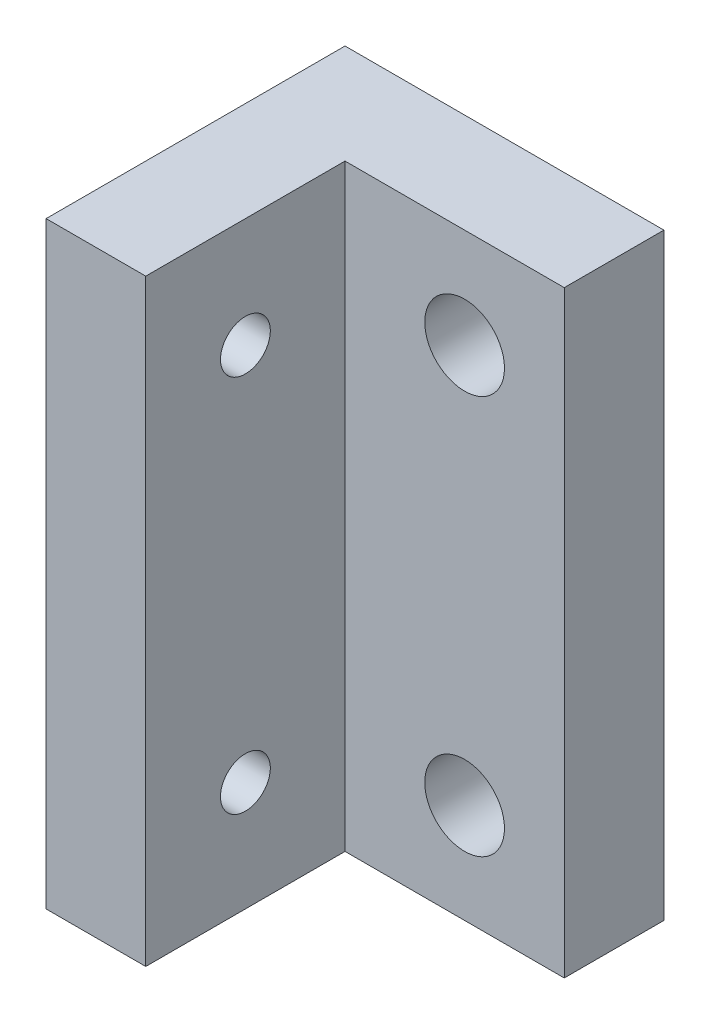
ISO-10303-21;
HEADER;
FILE_DESCRIPTION(('STEP AP214'),'2;1');
FILE_NAME('part.step','',(''),(''),'','','');
FILE_SCHEMA(('AUTOMOTIVE_DESIGN { 1 0 10303 214 1 1 1 1 }'));
ENDSEC;
DATA;
#1=APPLICATION_CONTEXT('core data for automotive mechanical design processes');
#2=APPLICATION_PROTOCOL_DEFINITION('international standard','automotive_design',2000,#1);
#3=PRODUCT_CONTEXT('',#1,'mechanical');
#4=PRODUCT('Part','Part','',(#3));
#5=PRODUCT_RELATED_PRODUCT_CATEGORY('part','',(#4));
#6=PRODUCT_DEFINITION_FORMATION('','',#4);
#7=PRODUCT_DEFINITION_CONTEXT('part definition',#1,'design');
#8=PRODUCT_DEFINITION('design','',#6,#7);
#9=PRODUCT_DEFINITION_SHAPE('','',#8);
#10=(LENGTH_UNIT() NAMED_UNIT(*) SI_UNIT(.MILLI.,.METRE.));
#11=(NAMED_UNIT(*) PLANE_ANGLE_UNIT() SI_UNIT($,.RADIAN.));
#12=(NAMED_UNIT(*) SI_UNIT($,.STERADIAN.) SOLID_ANGLE_UNIT());
#13=UNCERTAINTY_MEASURE_WITH_UNIT(LENGTH_MEASURE(1.E-05),#10,'distance_accuracy_value','');
#14=(GEOMETRIC_REPRESENTATION_CONTEXT(3) GLOBAL_UNCERTAINTY_ASSIGNED_CONTEXT((#13)) GLOBAL_UNIT_ASSIGNED_CONTEXT((#10,
#11,#12)) REPRESENTATION_CONTEXT('',''));
#15=CARTESIAN_POINT('',(0.,0.,0.));
#16=DIRECTION('',(0.,0.,1.));
#17=DIRECTION('',(1.,0.,0.));
#18=AXIS2_PLACEMENT_3D('',#15,#16,#17);
#19=CARTESIAN_POINT('',(0.,15.,0.));
#20=DIRECTION('',(1.,0.,0.));
#21=DIRECTION('',(0.,0.,-1.));
#22=AXIS2_PLACEMENT_3D('',#19,#20,#21);
#23=PLANE('',#22);
#24=CARTESIAN_POINT('',(0.,-9.5,10.));
#25=DIRECTION('',(-1.,0.,0.));
#26=DIRECTION('',(0.,0.,1.));
#27=AXIS2_PLACEMENT_3D('',#24,#25,#26);
#28=CIRCLE('',#27,1.25);
#29=CARTESIAN_POINT('',(0.,-9.5,11.25));
#30=VERTEX_POINT('',#29);
#31=EDGE_CURVE('E149',#30,#30,#28,.T.);
#32=ORIENTED_EDGE('',*,*,#31,.F.);
#33=EDGE_LOOP('',(#32));
#34=FACE_BOUND('',#33,.T.);
#35=CARTESIAN_POINT('',(0.,9.5,10.));
#36=DIRECTION('',(-1.,0.,0.));
#37=DIRECTION('',(0.,0.,1.));
#38=AXIS2_PLACEMENT_3D('',#35,#36,#37);
#39=CIRCLE('',#38,1.25);
#40=CARTESIAN_POINT('',(0.,9.5,11.25));
#41=VERTEX_POINT('',#40);
#42=EDGE_CURVE('E138',#41,#41,#39,.T.);
#43=ORIENTED_EDGE('',*,*,#42,.F.);
#44=EDGE_LOOP('',(#43));
#45=FACE_BOUND('',#44,.T.);
#46=DIRECTION('',(0.,0.,1.));
#47=VECTOR('',#46,1.);
#48=CARTESIAN_POINT('',(0.,-15.,0.));
#49=LINE('',#48,#47);
#50=CARTESIAN_POINT('',(0.,-15.,0.));
#51=VERTEX_POINT('',#50);
#52=CARTESIAN_POINT('',(0.,-15.,15.));
#53=VERTEX_POINT('',#52);
#54=EDGE_CURVE('E119',#51,#53,#49,.T.);
#55=ORIENTED_EDGE('',*,*,#54,.T.);
#56=DIRECTION('',(0.,-1.,0.));
#57=VECTOR('',#56,1.);
#58=CARTESIAN_POINT('',(0.,15.,15.));
#59=LINE('',#58,#57);
#60=CARTESIAN_POINT('',(0.,15.,15.));
#61=VERTEX_POINT('',#60);
#62=EDGE_CURVE('E11',#61,#53,#59,.T.);
#63=ORIENTED_EDGE('',*,*,#62,.F.);
#64=DIRECTION('',(0.,0.,1.));
#65=VECTOR('',#64,1.);
#66=CARTESIAN_POINT('',(0.,15.,0.));
#67=LINE('',#66,#65);
#68=CARTESIAN_POINT('',(0.,15.,0.));
#69=VERTEX_POINT('',#68);
#70=EDGE_CURVE('E130',#69,#61,#67,.T.);
#71=ORIENTED_EDGE('',*,*,#70,.F.);
#72=DIRECTION('',(0.,-1.,0.));
#73=VECTOR('',#72,1.);
#74=CARTESIAN_POINT('',(0.,15.,0.));
#75=LINE('',#74,#73);
#76=EDGE_CURVE('E115',#69,#51,#75,.T.);
#77=ORIENTED_EDGE('',*,*,#76,.T.);
#78=EDGE_LOOP('',(#55,#63,#71,#77));
#79=FACE_BOUND('',#78,.T.);
#80=ADVANCED_FACE('F33',(#34,#45,#79),#23,.F.);
#81=CARTESIAN_POINT('',(0.,15.,15.));
#82=DIRECTION('',(0.,0.,-1.));
#83=DIRECTION('',(-1.,0.,0.));
#84=AXIS2_PLACEMENT_3D('',#81,#82,#83);
#85=PLANE('',#84);
#86=DIRECTION('',(1.,0.,0.));
#87=VECTOR('',#86,1.);
#88=CARTESIAN_POINT('',(0.,-15.,15.));
#89=LINE('',#88,#87);
#90=CARTESIAN_POINT('',(5.,-15.,15.));
#91=VERTEX_POINT('',#90);
#92=EDGE_CURVE('E122',#53,#91,#89,.T.);
#93=ORIENTED_EDGE('',*,*,#92,.T.);
#94=DIRECTION('',(0.,-1.,0.));
#95=VECTOR('',#94,1.);
#96=CARTESIAN_POINT('',(5.,15.,15.));
#97=LINE('',#96,#95);
#98=CARTESIAN_POINT('',(5.,15.,15.));
#99=VERTEX_POINT('',#98);
#100=EDGE_CURVE('E42',#99,#91,#97,.T.);
#101=ORIENTED_EDGE('',*,*,#100,.F.);
#102=DIRECTION('',(1.,0.,0.));
#103=VECTOR('',#102,1.);
#104=CARTESIAN_POINT('',(0.,15.,15.));
#105=LINE('',#104,#103);
#106=EDGE_CURVE('E88',#61,#99,#105,.T.);
#107=ORIENTED_EDGE('',*,*,#106,.F.);
#108=ORIENTED_EDGE('',*,*,#62,.T.);
#109=EDGE_LOOP('',(#93,#101,#107,#108));
#110=FACE_BOUND('',#109,.T.);
#111=ADVANCED_FACE('F162',(#110),#85,.F.);
#112=CARTESIAN_POINT('',(5.,15.,15.));
#113=DIRECTION('',(-1.,0.,0.));
#114=DIRECTION('',(0.,0.,1.));
#115=AXIS2_PLACEMENT_3D('',#112,#113,#114);
#116=PLANE('',#115);
#117=CARTESIAN_POINT('',(5.,-9.5,10.));
#118=DIRECTION('',(-1.,0.,0.));
#119=DIRECTION('',(0.,0.,1.));
#120=AXIS2_PLACEMENT_3D('',#117,#118,#119);
#121=CIRCLE('',#120,1.25);
#122=CARTESIAN_POINT('',(5.,-9.5,11.25));
#123=VERTEX_POINT('',#122);
#124=EDGE_CURVE('E36',#123,#123,#121,.T.);
#125=ORIENTED_EDGE('',*,*,#124,.T.);
#126=EDGE_LOOP('',(#125));
#127=FACE_BOUND('',#126,.T.);
#128=CARTESIAN_POINT('',(5.,9.5,10.));
#129=DIRECTION('',(-1.,0.,0.));
#130=DIRECTION('',(0.,0.,1.));
#131=AXIS2_PLACEMENT_3D('',#128,#129,#130);
#132=CIRCLE('',#131,1.25);
#133=CARTESIAN_POINT('',(5.,9.5,11.25));
#134=VERTEX_POINT('',#133);
#135=EDGE_CURVE('E135',#134,#134,#132,.T.);
#136=ORIENTED_EDGE('',*,*,#135,.T.);
#137=EDGE_LOOP('',(#136));
#138=FACE_BOUND('',#137,.T.);
#139=DIRECTION('',(0.,0.,-1.));
#140=VECTOR('',#139,1.);
#141=CARTESIAN_POINT('',(5.,-15.,15.));
#142=LINE('',#141,#140);
#143=CARTESIAN_POINT('',(5.,-15.,5.));
#144=VERTEX_POINT('',#143);
#145=EDGE_CURVE('E125',#91,#144,#142,.T.);
#146=ORIENTED_EDGE('',*,*,#145,.T.);
#147=DIRECTION('',(0.,-1.,0.));
#148=VECTOR('',#147,1.);
#149=CARTESIAN_POINT('',(5.,15.,5.));
#150=LINE('',#149,#148);
#151=CARTESIAN_POINT('',(5.,15.,5.));
#152=VERTEX_POINT('',#151);
#153=EDGE_CURVE('E110',#152,#144,#150,.T.);
#154=ORIENTED_EDGE('',*,*,#153,.F.);
#155=DIRECTION('',(0.,0.,-1.));
#156=VECTOR('',#155,1.);
#157=CARTESIAN_POINT('',(5.,15.,15.));
#158=LINE('',#157,#156);
#159=EDGE_CURVE('E101',#99,#152,#158,.T.);
#160=ORIENTED_EDGE('',*,*,#159,.F.);
#161=ORIENTED_EDGE('',*,*,#100,.T.);
#162=EDGE_LOOP('',(#146,#154,#160,#161));
#163=FACE_BOUND('',#162,.T.);
#164=ADVANCED_FACE('F165',(#127,#138,#163),#116,.F.);
#165=CARTESIAN_POINT('',(16.,15.,5.));
#166=DIRECTION('',(0.,0.,-1.));
#167=DIRECTION('',(-1.,0.,0.));
#168=AXIS2_PLACEMENT_3D('',#165,#166,#167);
#169=PLANE('',#168);
#170=CARTESIAN_POINT('',(11.,-10.,5.));
#171=DIRECTION('',(0.,0.,1.));
#172=DIRECTION('',(1.,0.,0.));
#173=AXIS2_PLACEMENT_3D('',#170,#171,#172);
#174=CIRCLE('',#173,2.);
#175=CARTESIAN_POINT('',(13.,-10.,5.));
#176=VERTEX_POINT('',#175);
#177=EDGE_CURVE('E137',#176,#176,#174,.T.);
#178=ORIENTED_EDGE('',*,*,#177,.F.);
#179=EDGE_LOOP('',(#178));
#180=FACE_BOUND('',#179,.T.);
#181=CARTESIAN_POINT('',(11.,10.,5.));
#182=DIRECTION('',(0.,0.,1.));
#183=DIRECTION('',(1.,0.,0.));
#184=AXIS2_PLACEMENT_3D('',#181,#182,#183);
#185=CIRCLE('',#184,2.);
#186=CARTESIAN_POINT('',(13.,10.,5.));
#187=VERTEX_POINT('',#186);
#188=EDGE_CURVE('E153',#187,#187,#185,.T.);
#189=ORIENTED_EDGE('',*,*,#188,.F.);
#190=EDGE_LOOP('',(#189));
#191=FACE_BOUND('',#190,.T.);
#192=DIRECTION('',(1.,0.,0.));
#193=VECTOR('',#192,1.);
#194=CARTESIAN_POINT('',(16.,-15.,5.));
#195=LINE('',#194,#193);
#196=CARTESIAN_POINT('',(16.,-15.,5.));
#197=VERTEX_POINT('',#196);
#198=EDGE_CURVE('E109',#144,#197,#195,.T.);
#199=ORIENTED_EDGE('',*,*,#198,.T.);
#200=DIRECTION('',(0.,-1.,0.));
#201=VECTOR('',#200,1.);
#202=CARTESIAN_POINT('',(16.,15.,5.));
#203=LINE('',#202,#201);
#204=CARTESIAN_POINT('',(16.,15.,5.));
#205=VERTEX_POINT('',#204);
#206=EDGE_CURVE('E106',#205,#197,#203,.T.);
#207=ORIENTED_EDGE('',*,*,#206,.F.);
#208=DIRECTION('',(1.,0.,0.));
#209=VECTOR('',#208,1.);
#210=CARTESIAN_POINT('',(16.,15.,5.));
#211=LINE('',#210,#209);
#212=EDGE_CURVE('E95',#152,#205,#211,.T.);
#213=ORIENTED_EDGE('',*,*,#212,.F.);
#214=ORIENTED_EDGE('',*,*,#153,.T.);
#215=EDGE_LOOP('',(#199,#207,#213,#214));
#216=FACE_BOUND('',#215,.T.);
#217=ADVANCED_FACE('F107',(#180,#191,#216),#169,.F.);
#218=CARTESIAN_POINT('',(16.,15.,0.));
#219=DIRECTION('',(-1.,0.,0.));
#220=DIRECTION('',(0.,0.,1.));
#221=AXIS2_PLACEMENT_3D('',#218,#219,#220);
#222=PLANE('',#221);
#223=DIRECTION('',(0.,0.,-1.));
#224=VECTOR('',#223,1.);
#225=CARTESIAN_POINT('',(16.,-15.,0.));
#226=LINE('',#225,#224);
#227=CARTESIAN_POINT('',(16.,-15.,0.));
#228=VERTEX_POINT('',#227);
#229=EDGE_CURVE('E74',#197,#228,#226,.T.);
#230=ORIENTED_EDGE('',*,*,#229,.T.);
#231=DIRECTION('',(0.,-1.,0.));
#232=VECTOR('',#231,1.);
#233=CARTESIAN_POINT('',(16.,15.,0.));
#234=LINE('',#233,#232);
#235=CARTESIAN_POINT('',(16.,15.,0.));
#236=VERTEX_POINT('',#235);
#237=EDGE_CURVE('E111',#236,#228,#234,.T.);
#238=ORIENTED_EDGE('',*,*,#237,.F.);
#239=DIRECTION('',(0.,0.,-1.));
#240=VECTOR('',#239,1.);
#241=CARTESIAN_POINT('',(16.,15.,0.));
#242=LINE('',#241,#240);
#243=EDGE_CURVE('E99',#205,#236,#242,.T.);
#244=ORIENTED_EDGE('',*,*,#243,.F.);
#245=ORIENTED_EDGE('',*,*,#206,.T.);
#246=EDGE_LOOP('',(#230,#238,#244,#245));
#247=FACE_BOUND('',#246,.T.);
#248=ADVANCED_FACE('F113',(#247),#222,.F.);
#249=CARTESIAN_POINT('',(0.,15.,0.));
#250=DIRECTION('',(0.,0.,1.));
#251=DIRECTION('',(1.,0.,0.));
#252=AXIS2_PLACEMENT_3D('',#249,#250,#251);
#253=PLANE('',#252);
#254=CARTESIAN_POINT('',(11.,-10.,0.));
#255=DIRECTION('',(0.,0.,1.));
#256=DIRECTION('',(1.,0.,0.));
#257=AXIS2_PLACEMENT_3D('',#254,#255,#256);
#258=CIRCLE('',#257,2.);
#259=CARTESIAN_POINT('',(13.,-10.,0.));
#260=VERTEX_POINT('',#259);
#261=EDGE_CURVE('E142',#260,#260,#258,.T.);
#262=ORIENTED_EDGE('',*,*,#261,.T.);
#263=EDGE_LOOP('',(#262));
#264=FACE_BOUND('',#263,.T.);
#265=CARTESIAN_POINT('',(11.,10.,0.));
#266=DIRECTION('',(0.,0.,1.));
#267=DIRECTION('',(1.,0.,0.));
#268=AXIS2_PLACEMENT_3D('',#265,#266,#267);
#269=CIRCLE('',#268,2.);
#270=CARTESIAN_POINT('',(13.,10.,0.));
#271=VERTEX_POINT('',#270);
#272=EDGE_CURVE('E123',#271,#271,#269,.T.);
#273=ORIENTED_EDGE('',*,*,#272,.T.);
#274=EDGE_LOOP('',(#273));
#275=FACE_BOUND('',#274,.T.);
#276=DIRECTION('',(-1.,0.,0.));
#277=VECTOR('',#276,1.);
#278=CARTESIAN_POINT('',(0.,-15.,0.));
#279=LINE('',#278,#277);
#280=EDGE_CURVE('E80',#228,#51,#279,.T.);
#281=ORIENTED_EDGE('',*,*,#280,.T.);
#282=ORIENTED_EDGE('',*,*,#76,.F.);
#283=DIRECTION('',(-1.,0.,0.));
#284=VECTOR('',#283,1.);
#285=CARTESIAN_POINT('',(0.,15.,0.));
#286=LINE('',#285,#284);
#287=EDGE_CURVE('E51',#236,#69,#286,.T.);
#288=ORIENTED_EDGE('',*,*,#287,.F.);
#289=ORIENTED_EDGE('',*,*,#237,.T.);
#290=EDGE_LOOP('',(#281,#282,#288,#289));
#291=FACE_BOUND('',#290,.T.);
#292=ADVANCED_FACE('F170',(#264,#275,#291),#253,.F.);
#293=CARTESIAN_POINT('',(0.,15.,0.));
#294=DIRECTION('',(0.,1.,0.));
#295=DIRECTION('',(0.,0.,1.));
#296=AXIS2_PLACEMENT_3D('',#293,#294,#295);
#297=PLANE('',#296);
#298=ORIENTED_EDGE('',*,*,#70,.T.);
#299=ORIENTED_EDGE('',*,*,#106,.T.);
#300=ORIENTED_EDGE('',*,*,#159,.T.);
#301=ORIENTED_EDGE('',*,*,#212,.T.);
#302=ORIENTED_EDGE('',*,*,#243,.T.);
#303=ORIENTED_EDGE('',*,*,#287,.T.);
#304=EDGE_LOOP('',(#298,#299,#300,#301,#302,#303));
#305=FACE_BOUND('',#304,.T.);
#306=ADVANCED_FACE('F97',(#305),#297,.T.);
#307=CARTESIAN_POINT('',(0.,-15.,0.));
#308=DIRECTION('',(0.,1.,0.));
#309=DIRECTION('',(0.,0.,1.));
#310=AXIS2_PLACEMENT_3D('',#307,#308,#309);
#311=PLANE('',#310);
#312=ORIENTED_EDGE('',*,*,#54,.F.);
#313=ORIENTED_EDGE('',*,*,#280,.F.);
#314=ORIENTED_EDGE('',*,*,#229,.F.);
#315=ORIENTED_EDGE('',*,*,#198,.F.);
#316=ORIENTED_EDGE('',*,*,#145,.F.);
#317=ORIENTED_EDGE('',*,*,#92,.F.);
#318=EDGE_LOOP('',(#312,#313,#314,#315,#316,#317));
#319=FACE_BOUND('',#318,.T.);
#320=ADVANCED_FACE('F168',(#319),#311,.F.);
#321=CARTESIAN_POINT('',(11.,10.,0.));
#322=DIRECTION('',(0.,0.,1.));
#323=DIRECTION('',(1.,0.,0.));
#324=AXIS2_PLACEMENT_3D('',#321,#322,#323);
#325=CYLINDRICAL_SURFACE('',#324,2.);
#326=ORIENTED_EDGE('',*,*,#272,.F.);
#327=EDGE_LOOP('',(#326));
#328=FACE_BOUND('',#327,.T.);
#329=ORIENTED_EDGE('',*,*,#188,.T.);
#330=EDGE_LOOP('',(#329));
#331=FACE_BOUND('',#330,.T.);
#332=ADVANCED_FACE('F211',(#328,#331),#325,.F.);
#333=CARTESIAN_POINT('',(11.,-10.,0.));
#334=DIRECTION('',(0.,0.,1.));
#335=DIRECTION('',(1.,0.,0.));
#336=AXIS2_PLACEMENT_3D('',#333,#334,#335);
#337=CYLINDRICAL_SURFACE('',#336,2.);
#338=ORIENTED_EDGE('',*,*,#261,.F.);
#339=EDGE_LOOP('',(#338));
#340=FACE_BOUND('',#339,.T.);
#341=ORIENTED_EDGE('',*,*,#177,.T.);
#342=EDGE_LOOP('',(#341));
#343=FACE_BOUND('',#342,.T.);
#344=ADVANCED_FACE('F213',(#340,#343),#337,.F.);
#345=CARTESIAN_POINT('',(16.,9.5,9.99999999999999));
#346=DIRECTION('',(-1.,0.,0.));
#347=DIRECTION('',(0.,0.,1.));
#348=AXIS2_PLACEMENT_3D('',#345,#346,#347);
#349=CYLINDRICAL_SURFACE('',#348,1.25);
#350=ORIENTED_EDGE('',*,*,#42,.T.);
#351=EDGE_LOOP('',(#350));
#352=FACE_BOUND('',#351,.T.);
#353=ORIENTED_EDGE('',*,*,#135,.F.);
#354=EDGE_LOOP('',(#353));
#355=FACE_BOUND('',#354,.T.);
#356=ADVANCED_FACE('F194',(#352,#355),#349,.F.);
#357=CARTESIAN_POINT('',(16.,-9.5,9.99999999999999));
#358=DIRECTION('',(-1.,0.,0.));
#359=DIRECTION('',(0.,0.,1.));
#360=AXIS2_PLACEMENT_3D('',#357,#358,#359);
#361=CYLINDRICAL_SURFACE('',#360,1.25);
#362=ORIENTED_EDGE('',*,*,#31,.T.);
#363=EDGE_LOOP('',(#362));
#364=FACE_BOUND('',#363,.T.);
#365=ORIENTED_EDGE('',*,*,#124,.F.);
#366=EDGE_LOOP('',(#365));
#367=FACE_BOUND('',#366,.T.);
#368=ADVANCED_FACE('F191',(#364,#367),#361,.F.);
#369=CLOSED_SHELL('',(#80,#111,#164,#217,#248,#292,#306,#320,#332,#344,#356,#368));
#370=MANIFOLD_SOLID_BREP('B2',#369);
#371=ADVANCED_BREP_SHAPE_REPRESENTATION('',(#18,#370),#14);
#372=SHAPE_DEFINITION_REPRESENTATION(#9,#371);
ENDSEC;
END-ISO-10303-21;
